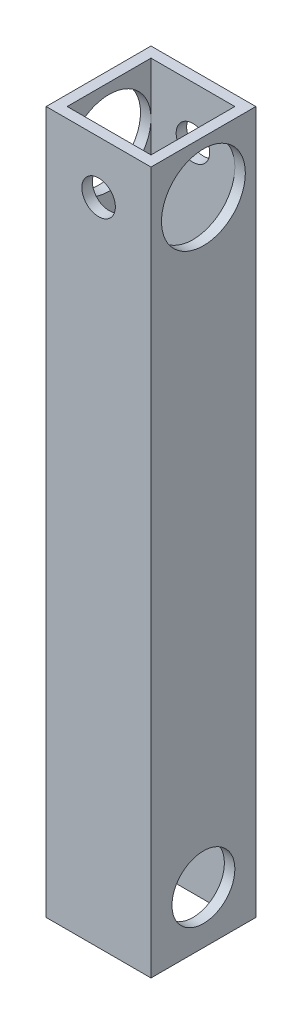
ISO-10303-21;
HEADER;
FILE_DESCRIPTION(('STEP AP214'),'2;1');
FILE_NAME('part.step','',(''),(''),'','','');
FILE_SCHEMA(('AUTOMOTIVE_DESIGN { 1 0 10303 214 1 1 1 1 }'));
ENDSEC;
DATA;
#1=APPLICATION_CONTEXT('core data for automotive mechanical design processes');
#2=APPLICATION_PROTOCOL_DEFINITION('international standard','automotive_design',2000,#1);
#3=PRODUCT_CONTEXT('',#1,'mechanical');
#4=PRODUCT('Part','Part','',(#3));
#5=PRODUCT_RELATED_PRODUCT_CATEGORY('part','',(#4));
#6=PRODUCT_DEFINITION_FORMATION('','',#4);
#7=PRODUCT_DEFINITION_CONTEXT('part definition',#1,'design');
#8=PRODUCT_DEFINITION('design','',#6,#7);
#9=PRODUCT_DEFINITION_SHAPE('','',#8);
#10=(LENGTH_UNIT() NAMED_UNIT(*) SI_UNIT(.MILLI.,.METRE.));
#11=(NAMED_UNIT(*) PLANE_ANGLE_UNIT() SI_UNIT($,.RADIAN.));
#12=(NAMED_UNIT(*) SI_UNIT($,.STERADIAN.) SOLID_ANGLE_UNIT());
#13=UNCERTAINTY_MEASURE_WITH_UNIT(LENGTH_MEASURE(1.E-05),#10,'distance_accuracy_value','');
#14=(GEOMETRIC_REPRESENTATION_CONTEXT(3) GLOBAL_UNCERTAINTY_ASSIGNED_CONTEXT((#13)) GLOBAL_UNIT_ASSIGNED_CONTEXT((#10,
#11,#12)) REPRESENTATION_CONTEXT('',''));
#15=CARTESIAN_POINT('',(0.,0.,0.));
#16=DIRECTION('',(0.,0.,1.));
#17=DIRECTION('',(1.,0.,0.));
#18=AXIS2_PLACEMENT_3D('',#15,#16,#17);
#19=CARTESIAN_POINT('',(1.,67.,0.));
#20=DIRECTION('',(1.,0.,0.));
#21=DIRECTION('',(0.,0.,-1.));
#22=AXIS2_PLACEMENT_3D('',#19,#20,#21);
#23=PLANE('',#22);
#24=CARTESIAN_POINT('',(0.999999999999999,62.,-5.));
#25=DIRECTION('',(1.,0.,0.));
#26=DIRECTION('',(0.,0.,-1.));
#27=AXIS2_PLACEMENT_3D('',#24,#25,#26);
#28=CIRCLE('',#27,4.);
#29=CARTESIAN_POINT('',(0.999999999999999,62.,-9.));
#30=VERTEX_POINT('',#29);
#31=CARTESIAN_POINT('',(1.,62.,-1.));
#32=VERTEX_POINT('',#31);
#33=EDGE_CURVE('E75',#30,#32,#28,.T.);
#34=ORIENTED_EDGE('',*,*,#33,.F.);
#35=DIRECTION('',(0.,-1.,0.));
#36=VECTOR('',#35,1.);
#37=CARTESIAN_POINT('',(1.,67.,-9.));
#38=LINE('',#37,#36);
#39=CARTESIAN_POINT('',(1.,67.,-9.));
#40=VERTEX_POINT('',#39);
#41=EDGE_CURVE('E234',#40,#30,#38,.T.);
#42=ORIENTED_EDGE('',*,*,#41,.F.);
#43=DIRECTION('',(0.,0.,1.));
#44=VECTOR('',#43,1.);
#45=CARTESIAN_POINT('',(1.,67.,0.));
#46=LINE('',#45,#44);
#47=CARTESIAN_POINT('',(1.,67.,-1.));
#48=VERTEX_POINT('',#47);
#49=EDGE_CURVE('E219',#40,#48,#46,.T.);
#50=ORIENTED_EDGE('',*,*,#49,.T.);
#51=DIRECTION('',(0.,-1.,0.));
#52=VECTOR('',#51,1.);
#53=CARTESIAN_POINT('',(1.,67.,-1.));
#54=LINE('',#53,#52);
#55=EDGE_CURVE('E169',#48,#32,#54,.T.);
#56=ORIENTED_EDGE('',*,*,#55,.T.);
#57=EDGE_LOOP('',(#34,#42,#50,#56));
#58=FACE_BOUND('',#57,.T.);
#59=ADVANCED_FACE('F59',(#58),#23,.T.);
#60=CARTESIAN_POINT('',(9.,67.,0.));
#61=DIRECTION('',(-1.,0.,0.));
#62=DIRECTION('',(0.,0.,1.));
#63=AXIS2_PLACEMENT_3D('',#60,#61,#62);
#64=PLANE('',#63);
#65=CARTESIAN_POINT('',(9.,62.,-5.));
#66=DIRECTION('',(-1.,0.,0.));
#67=DIRECTION('',(0.,0.,1.));
#68=AXIS2_PLACEMENT_3D('',#65,#66,#67);
#69=CIRCLE('',#68,4.);
#70=CARTESIAN_POINT('',(9.,62.,-1.));
#71=VERTEX_POINT('',#70);
#72=CARTESIAN_POINT('',(9.,62.,-9.));
#73=VERTEX_POINT('',#72);
#74=EDGE_CURVE('E82',#71,#73,#69,.T.);
#75=ORIENTED_EDGE('',*,*,#74,.F.);
#76=DIRECTION('',(0.,-1.,0.));
#77=VECTOR('',#76,1.);
#78=CARTESIAN_POINT('',(9.,67.,-1.));
#79=LINE('',#78,#77);
#80=CARTESIAN_POINT('',(9.,67.,-1.));
#81=VERTEX_POINT('',#80);
#82=EDGE_CURVE('E149',#81,#71,#79,.T.);
#83=ORIENTED_EDGE('',*,*,#82,.F.);
#84=DIRECTION('',(0.,0.,-1.));
#85=VECTOR('',#84,1.);
#86=CARTESIAN_POINT('',(9.,67.,0.));
#87=LINE('',#86,#85);
#88=CARTESIAN_POINT('',(9.,67.,-9.));
#89=VERTEX_POINT('',#88);
#90=EDGE_CURVE('E223',#81,#89,#87,.T.);
#91=ORIENTED_EDGE('',*,*,#90,.T.);
#92=DIRECTION('',(0.,-1.,0.));
#93=VECTOR('',#92,1.);
#94=CARTESIAN_POINT('',(9.,67.,-9.));
#95=LINE('',#94,#93);
#96=EDGE_CURVE('E151',#89,#73,#95,.T.);
#97=ORIENTED_EDGE('',*,*,#96,.T.);
#98=EDGE_LOOP('',(#75,#83,#91,#97));
#99=FACE_BOUND('',#98,.T.);
#100=ADVANCED_FACE('F146',(#99),#64,.T.);
#101=CARTESIAN_POINT('',(0.,67.,0.));
#102=DIRECTION('',(0.,1.,0.));
#103=DIRECTION('',(0.,0.,1.));
#104=AXIS2_PLACEMENT_3D('',#101,#102,#103);
#105=PLANE('',#104);
#106=DIRECTION('',(0.,0.,1.));
#107=VECTOR('',#106,1.);
#108=CARTESIAN_POINT('',(0.,67.,0.));
#109=LINE('',#108,#107);
#110=CARTESIAN_POINT('',(0.,67.,-10.));
#111=VERTEX_POINT('',#110);
#112=CARTESIAN_POINT('',(0.,67.,0.));
#113=VERTEX_POINT('',#112);
#114=EDGE_CURVE('E176',#111,#113,#109,.T.);
#115=ORIENTED_EDGE('',*,*,#114,.T.);
#116=DIRECTION('',(1.,0.,0.));
#117=VECTOR('',#116,1.);
#118=CARTESIAN_POINT('',(0.,67.,0.));
#119=LINE('',#118,#117);
#120=CARTESIAN_POINT('',(10.,67.,0.));
#121=VERTEX_POINT('',#120);
#122=EDGE_CURVE('E179',#113,#121,#119,.T.);
#123=ORIENTED_EDGE('',*,*,#122,.T.);
#124=DIRECTION('',(0.,0.,-1.));
#125=VECTOR('',#124,1.);
#126=CARTESIAN_POINT('',(10.,67.,0.));
#127=LINE('',#126,#125);
#128=CARTESIAN_POINT('',(10.,67.,-10.));
#129=VERTEX_POINT('',#128);
#130=EDGE_CURVE('E182',#121,#129,#127,.T.);
#131=ORIENTED_EDGE('',*,*,#130,.T.);
#132=DIRECTION('',(-1.,0.,0.));
#133=VECTOR('',#132,1.);
#134=CARTESIAN_POINT('',(0.,67.,-10.));
#135=LINE('',#134,#133);
#136=EDGE_CURVE('E184',#129,#111,#135,.T.);
#137=ORIENTED_EDGE('',*,*,#136,.T.);
#138=EDGE_LOOP('',(#115,#123,#131,#137));
#139=FACE_BOUND('',#138,.T.);
#140=DIRECTION('',(1.,0.,0.));
#141=VECTOR('',#140,1.);
#142=CARTESIAN_POINT('',(0.,67.,-1.));
#143=LINE('',#142,#141);
#144=EDGE_CURVE('E167',#48,#81,#143,.T.);
#145=ORIENTED_EDGE('',*,*,#144,.F.);
#146=ORIENTED_EDGE('',*,*,#49,.F.);
#147=DIRECTION('',(-1.,0.,0.));
#148=VECTOR('',#147,1.);
#149=CARTESIAN_POINT('',(0.,67.,-9.));
#150=LINE('',#149,#148);
#151=EDGE_CURVE('E225',#89,#40,#150,.T.);
#152=ORIENTED_EDGE('',*,*,#151,.F.);
#153=ORIENTED_EDGE('',*,*,#90,.F.);
#154=EDGE_LOOP('',(#145,#146,#152,#153));
#155=FACE_BOUND('',#154,.T.);
#156=ADVANCED_FACE('F252',(#139,#155),#105,.T.);
#157=CARTESIAN_POINT('',(0.,0.,0.));
#158=DIRECTION('',(0.,1.,0.));
#159=DIRECTION('',(0.,0.,1.));
#160=AXIS2_PLACEMENT_3D('',#157,#158,#159);
#161=PLANE('',#160);
#162=DIRECTION('',(0.,0.,1.));
#163=VECTOR('',#162,1.);
#164=CARTESIAN_POINT('',(0.,0.,0.));
#165=LINE('',#164,#163);
#166=CARTESIAN_POINT('',(0.,0.,-10.));
#167=VERTEX_POINT('',#166);
#168=CARTESIAN_POINT('',(0.,0.,0.));
#169=VERTEX_POINT('',#168);
#170=EDGE_CURVE('E175',#167,#169,#165,.T.);
#171=ORIENTED_EDGE('',*,*,#170,.F.);
#172=DIRECTION('',(-1.,0.,0.));
#173=VECTOR('',#172,1.);
#174=CARTESIAN_POINT('',(0.,0.,-10.));
#175=LINE('',#174,#173);
#176=CARTESIAN_POINT('',(10.,0.,-10.));
#177=VERTEX_POINT('',#176);
#178=EDGE_CURVE('E180',#177,#167,#175,.T.);
#179=ORIENTED_EDGE('',*,*,#178,.F.);
#180=DIRECTION('',(0.,0.,-1.));
#181=VECTOR('',#180,1.);
#182=CARTESIAN_POINT('',(10.,0.,0.));
#183=LINE('',#182,#181);
#184=CARTESIAN_POINT('',(10.,0.,0.));
#185=VERTEX_POINT('',#184);
#186=EDGE_CURVE('E191',#185,#177,#183,.T.);
#187=ORIENTED_EDGE('',*,*,#186,.F.);
#188=DIRECTION('',(1.,0.,0.));
#189=VECTOR('',#188,1.);
#190=CARTESIAN_POINT('',(0.,0.,0.));
#191=LINE('',#190,#189);
#192=EDGE_CURVE('E189',#169,#185,#191,.T.);
#193=ORIENTED_EDGE('',*,*,#192,.F.);
#194=EDGE_LOOP('',(#171,#179,#187,#193));
#195=FACE_BOUND('',#194,.T.);
#196=DIRECTION('',(0.,0.,1.));
#197=VECTOR('',#196,1.);
#198=CARTESIAN_POINT('',(1.,0.,0.));
#199=LINE('',#198,#197);
#200=CARTESIAN_POINT('',(1.,0.,-9.));
#201=VERTEX_POINT('',#200);
#202=CARTESIAN_POINT('',(1.,0.,-1.));
#203=VERTEX_POINT('',#202);
#204=EDGE_CURVE('E207',#201,#203,#199,.T.);
#205=ORIENTED_EDGE('',*,*,#204,.T.);
#206=DIRECTION('',(1.,0.,0.));
#207=VECTOR('',#206,1.);
#208=CARTESIAN_POINT('',(0.,0.,-1.));
#209=LINE('',#208,#207);
#210=CARTESIAN_POINT('',(9.,0.,-1.));
#211=VERTEX_POINT('',#210);
#212=EDGE_CURVE('E230',#203,#211,#209,.T.);
#213=ORIENTED_EDGE('',*,*,#212,.T.);
#214=DIRECTION('',(0.,0.,-1.));
#215=VECTOR('',#214,1.);
#216=CARTESIAN_POINT('',(9.,0.,0.));
#217=LINE('',#216,#215);
#218=CARTESIAN_POINT('',(9.,0.,-9.));
#219=VERTEX_POINT('',#218);
#220=EDGE_CURVE('E158',#211,#219,#217,.T.);
#221=ORIENTED_EDGE('',*,*,#220,.T.);
#222=DIRECTION('',(-1.,0.,0.));
#223=VECTOR('',#222,1.);
#224=CARTESIAN_POINT('',(0.,0.,-9.));
#225=LINE('',#224,#223);
#226=EDGE_CURVE('E221',#219,#201,#225,.T.);
#227=ORIENTED_EDGE('',*,*,#226,.T.);
#228=EDGE_LOOP('',(#205,#213,#221,#227));
#229=FACE_BOUND('',#228,.T.);
#230=ADVANCED_FACE('F247',(#195,#229),#161,.F.);
#231=CARTESIAN_POINT('',(0.,67.,0.));
#232=DIRECTION('',(1.,0.,0.));
#233=DIRECTION('',(0.,0.,-1.));
#234=AXIS2_PLACEMENT_3D('',#231,#232,#233);
#235=PLANE('',#234);
#236=CARTESIAN_POINT('',(0.,62.,-5.));
#237=DIRECTION('',(1.,0.,0.));
#238=DIRECTION('',(0.,0.,-1.));
#239=AXIS2_PLACEMENT_3D('',#236,#237,#238);
#240=CIRCLE('',#239,4.);
#241=CARTESIAN_POINT('',(0.,62.,-9.));
#242=VERTEX_POINT('',#241);
#243=EDGE_CURVE('E141',#242,#242,#240,.F.);
#244=ORIENTED_EDGE('',*,*,#243,.F.);
#245=EDGE_LOOP('',(#244));
#246=FACE_BOUND('',#245,.T.);
#247=CARTESIAN_POINT('',(0.,5.,-5.00000000000001));
#248=DIRECTION('',(1.,0.,0.));
#249=DIRECTION('',(0.,0.,-1.));
#250=AXIS2_PLACEMENT_3D('',#247,#248,#249);
#251=CIRCLE('',#250,3.);
#252=CARTESIAN_POINT('',(0.,5.,-8.00000000000001));
#253=VERTEX_POINT('',#252);
#254=EDGE_CURVE('E381',#253,#253,#251,.F.);
#255=ORIENTED_EDGE('',*,*,#254,.F.);
#256=EDGE_LOOP('',(#255));
#257=FACE_BOUND('',#256,.T.);
#258=ORIENTED_EDGE('',*,*,#170,.T.);
#259=DIRECTION('',(0.,-1.,0.));
#260=VECTOR('',#259,1.);
#261=CARTESIAN_POINT('',(0.,67.,0.));
#262=LINE('',#261,#260);
#263=EDGE_CURVE('E12',#113,#169,#262,.T.);
#264=ORIENTED_EDGE('',*,*,#263,.F.);
#265=ORIENTED_EDGE('',*,*,#114,.F.);
#266=DIRECTION('',(0.,-1.,0.));
#267=VECTOR('',#266,1.);
#268=CARTESIAN_POINT('',(0.,67.,-10.));
#269=LINE('',#268,#267);
#270=EDGE_CURVE('E186',#111,#167,#269,.T.);
#271=ORIENTED_EDGE('',*,*,#270,.T.);
#272=EDGE_LOOP('',(#258,#264,#265,#271));
#273=FACE_BOUND('',#272,.T.);
#274=ADVANCED_FACE('F61',(#246,#257,#273),#235,.F.);
#275=CARTESIAN_POINT('',(0.,67.,0.));
#276=DIRECTION('',(0.,0.,-1.));
#277=DIRECTION('',(-1.,0.,0.));
#278=AXIS2_PLACEMENT_3D('',#275,#276,#277);
#279=PLANE('',#278);
#280=CARTESIAN_POINT('',(5.,62.,0.));
#281=DIRECTION('',(0.,0.,1.));
#282=DIRECTION('',(1.,0.,0.));
#283=AXIS2_PLACEMENT_3D('',#280,#281,#282);
#284=CIRCLE('',#283,1.6);
#285=CARTESIAN_POINT('',(6.6,62.,0.));
#286=VERTEX_POINT('',#285);
#287=EDGE_CURVE('E210',#286,#286,#284,.T.);
#288=ORIENTED_EDGE('',*,*,#287,.F.);
#289=EDGE_LOOP('',(#288));
#290=FACE_BOUND('',#289,.T.);
#291=ORIENTED_EDGE('',*,*,#192,.T.);
#292=DIRECTION('',(0.,-1.,0.));
#293=VECTOR('',#292,1.);
#294=CARTESIAN_POINT('',(10.,67.,0.));
#295=LINE('',#294,#293);
#296=EDGE_CURVE('E68',#121,#185,#295,.T.);
#297=ORIENTED_EDGE('',*,*,#296,.F.);
#298=ORIENTED_EDGE('',*,*,#122,.F.);
#299=ORIENTED_EDGE('',*,*,#263,.T.);
#300=EDGE_LOOP('',(#291,#297,#298,#299));
#301=FACE_BOUND('',#300,.T.);
#302=ADVANCED_FACE('F281',(#290,#301),#279,.F.);
#303=CARTESIAN_POINT('',(10.,67.,0.));
#304=DIRECTION('',(-1.,0.,0.));
#305=DIRECTION('',(0.,0.,1.));
#306=AXIS2_PLACEMENT_3D('',#303,#304,#305);
#307=PLANE('',#306);
#308=CARTESIAN_POINT('',(10.,62.,-5.));
#309=DIRECTION('',(1.,0.,0.));
#310=DIRECTION('',(0.,0.,-1.));
#311=AXIS2_PLACEMENT_3D('',#308,#309,#310);
#312=CIRCLE('',#311,4.);
#313=CARTESIAN_POINT('',(10.,62.,-9.));
#314=VERTEX_POINT('',#313);
#315=EDGE_CURVE('E378',#314,#314,#312,.T.);
#316=ORIENTED_EDGE('',*,*,#315,.F.);
#317=EDGE_LOOP('',(#316));
#318=FACE_BOUND('',#317,.T.);
#319=CARTESIAN_POINT('',(10.,5.,-5.00000000000001));
#320=DIRECTION('',(1.,0.,0.));
#321=DIRECTION('',(0.,0.,-1.));
#322=AXIS2_PLACEMENT_3D('',#319,#320,#321);
#323=CIRCLE('',#322,3.);
#324=CARTESIAN_POINT('',(10.,5.,-8.00000000000001));
#325=VERTEX_POINT('',#324);
#326=EDGE_CURVE('E384',#325,#325,#323,.T.);
#327=ORIENTED_EDGE('',*,*,#326,.F.);
#328=EDGE_LOOP('',(#327));
#329=FACE_BOUND('',#328,.T.);
#330=ORIENTED_EDGE('',*,*,#186,.T.);
#331=DIRECTION('',(0.,-1.,0.));
#332=VECTOR('',#331,1.);
#333=CARTESIAN_POINT('',(10.,67.,-10.));
#334=LINE('',#333,#332);
#335=EDGE_CURVE('E196',#129,#177,#334,.T.);
#336=ORIENTED_EDGE('',*,*,#335,.F.);
#337=ORIENTED_EDGE('',*,*,#130,.F.);
#338=ORIENTED_EDGE('',*,*,#296,.T.);
#339=EDGE_LOOP('',(#330,#336,#337,#338));
#340=FACE_BOUND('',#339,.T.);
#341=ADVANCED_FACE('F275',(#318,#329,#340),#307,.F.);
#342=CARTESIAN_POINT('',(0.,67.,-10.));
#343=DIRECTION('',(0.,0.,1.));
#344=DIRECTION('',(1.,0.,0.));
#345=AXIS2_PLACEMENT_3D('',#342,#343,#344);
#346=PLANE('',#345);
#347=CARTESIAN_POINT('',(5.,62.,-10.));
#348=DIRECTION('',(0.,0.,1.));
#349=DIRECTION('',(1.,0.,0.));
#350=AXIS2_PLACEMENT_3D('',#347,#348,#349);
#351=CIRCLE('',#350,1.6);
#352=CARTESIAN_POINT('',(6.6,62.,-10.));
#353=VERTEX_POINT('',#352);
#354=EDGE_CURVE('E203',#353,#353,#351,.F.);
#355=ORIENTED_EDGE('',*,*,#354,.F.);
#356=EDGE_LOOP('',(#355));
#357=FACE_BOUND('',#356,.T.);
#358=ORIENTED_EDGE('',*,*,#178,.T.);
#359=ORIENTED_EDGE('',*,*,#270,.F.);
#360=ORIENTED_EDGE('',*,*,#136,.F.);
#361=ORIENTED_EDGE('',*,*,#335,.T.);
#362=EDGE_LOOP('',(#358,#359,#360,#361));
#363=FACE_BOUND('',#362,.T.);
#364=ADVANCED_FACE('F269',(#357,#363),#346,.F.);
#365=EDGE_CURVE('E152',#32,#30,#28,.T.);
#366=ORIENTED_EDGE('',*,*,#365,.F.);
#367=EDGE_CURVE('E168',#32,#203,#54,.T.);
#368=ORIENTED_EDGE('',*,*,#367,.T.);
#369=ORIENTED_EDGE('',*,*,#204,.F.);
#370=EDGE_CURVE('E227',#30,#201,#38,.T.);
#371=ORIENTED_EDGE('',*,*,#370,.F.);
#372=EDGE_LOOP('',(#366,#368,#369,#371));
#373=FACE_BOUND('',#372,.T.);
#374=CARTESIAN_POINT('',(0.999999999999999,5.,-5.00000000000001));
#375=DIRECTION('',(1.,0.,0.));
#376=DIRECTION('',(0.,0.,-1.));
#377=AXIS2_PLACEMENT_3D('',#374,#375,#376);
#378=CIRCLE('',#377,3.);
#379=CARTESIAN_POINT('',(0.999999999999999,5.,-8.00000000000001));
#380=VERTEX_POINT('',#379);
#381=EDGE_CURVE('E215',#380,#380,#378,.T.);
#382=ORIENTED_EDGE('',*,*,#381,.F.);
#383=EDGE_LOOP('',(#382));
#384=FACE_BOUND('',#383,.T.);
#385=ADVANCED_FACE('F244',(#373,#384),#23,.T.);
#386=CARTESIAN_POINT('',(0.,67.,-1.));
#387=DIRECTION('',(0.,0.,-1.));
#388=DIRECTION('',(-1.,0.,0.));
#389=AXIS2_PLACEMENT_3D('',#386,#387,#388);
#390=PLANE('',#389);
#391=CARTESIAN_POINT('',(5.,62.,-0.999999999999999));
#392=DIRECTION('',(0.,0.,-1.));
#393=DIRECTION('',(-1.,0.,0.));
#394=AXIS2_PLACEMENT_3D('',#391,#392,#393);
#395=CIRCLE('',#394,1.6);
#396=CARTESIAN_POINT('',(6.6,62.,-0.999999999999997));
#397=VERTEX_POINT('',#396);
#398=EDGE_CURVE('E202',#397,#397,#395,.T.);
#399=ORIENTED_EDGE('',*,*,#398,.F.);
#400=EDGE_LOOP('',(#399));
#401=FACE_BOUND('',#400,.T.);
#402=ORIENTED_EDGE('',*,*,#367,.F.);
#403=ORIENTED_EDGE('',*,*,#55,.F.);
#404=ORIENTED_EDGE('',*,*,#144,.T.);
#405=ORIENTED_EDGE('',*,*,#82,.T.);
#406=EDGE_CURVE('E154',#71,#211,#79,.T.);
#407=ORIENTED_EDGE('',*,*,#406,.T.);
#408=ORIENTED_EDGE('',*,*,#212,.F.);
#409=EDGE_LOOP('',(#402,#403,#404,#405,#407,#408));
#410=FACE_BOUND('',#409,.T.);
#411=ADVANCED_FACE('F164',(#401,#410),#390,.T.);
#412=EDGE_CURVE('E135',#73,#71,#69,.T.);
#413=ORIENTED_EDGE('',*,*,#412,.F.);
#414=EDGE_CURVE('E236',#73,#219,#95,.T.);
#415=ORIENTED_EDGE('',*,*,#414,.T.);
#416=ORIENTED_EDGE('',*,*,#220,.F.);
#417=ORIENTED_EDGE('',*,*,#406,.F.);
#418=EDGE_LOOP('',(#413,#415,#416,#417));
#419=FACE_BOUND('',#418,.T.);
#420=CARTESIAN_POINT('',(9.,5.,-5.00000000000001));
#421=DIRECTION('',(-1.,0.,0.));
#422=DIRECTION('',(0.,0.,1.));
#423=AXIS2_PLACEMENT_3D('',#420,#421,#422);
#424=CIRCLE('',#423,3.);
#425=CARTESIAN_POINT('',(9.,5.,-2.00000000000001));
#426=VERTEX_POINT('',#425);
#427=EDGE_CURVE('E63',#426,#426,#424,.T.);
#428=ORIENTED_EDGE('',*,*,#427,.F.);
#429=EDGE_LOOP('',(#428));
#430=FACE_BOUND('',#429,.T.);
#431=ADVANCED_FACE('F155',(#419,#430),#64,.T.);
#432=CARTESIAN_POINT('',(0.,67.,-9.));
#433=DIRECTION('',(0.,0.,1.));
#434=DIRECTION('',(1.,0.,0.));
#435=AXIS2_PLACEMENT_3D('',#432,#433,#434);
#436=PLANE('',#435);
#437=CARTESIAN_POINT('',(5.,62.,-9.));
#438=DIRECTION('',(0.,0.,1.));
#439=DIRECTION('',(1.,0.,0.));
#440=AXIS2_PLACEMENT_3D('',#437,#438,#439);
#441=CIRCLE('',#440,1.6);
#442=CARTESIAN_POINT('',(6.6,62.,-9.));
#443=VERTEX_POINT('',#442);
#444=EDGE_CURVE('E200',#443,#443,#441,.T.);
#445=ORIENTED_EDGE('',*,*,#444,.F.);
#446=EDGE_LOOP('',(#445));
#447=FACE_BOUND('',#446,.T.);
#448=ORIENTED_EDGE('',*,*,#41,.T.);
#449=ORIENTED_EDGE('',*,*,#370,.T.);
#450=ORIENTED_EDGE('',*,*,#226,.F.);
#451=ORIENTED_EDGE('',*,*,#414,.F.);
#452=ORIENTED_EDGE('',*,*,#96,.F.);
#453=ORIENTED_EDGE('',*,*,#151,.T.);
#454=EDGE_LOOP('',(#448,#449,#450,#451,#452,#453));
#455=FACE_BOUND('',#454,.T.);
#456=ADVANCED_FACE('F242',(#447,#455),#436,.T.);
#457=CARTESIAN_POINT('',(5.,62.,-14.5254833995939));
#458=DIRECTION('',(0.,0.,1.));
#459=DIRECTION('',(1.,0.,0.));
#460=AXIS2_PLACEMENT_3D('',#457,#458,#459);
#461=CYLINDRICAL_SURFACE('',#460,1.6);
#462=CARTESIAN_POINT('',(6.6,62.,-9.));
#463=CARTESIAN_POINT('',(6.6,62.,-9.01041666666667));
#464=CARTESIAN_POINT('',(6.6,62.,-9.02083333333333));
#465=CARTESIAN_POINT('',(6.6,62.,-9.04166666666667));
#466=CARTESIAN_POINT('',(6.6,62.,-9.05208333333333));
#467=CARTESIAN_POINT('',(6.6,62.,-9.07291666666667));
#468=CARTESIAN_POINT('',(6.6,62.,-9.08333333333333));
#469=CARTESIAN_POINT('',(6.6,62.,-9.10416666666667));
#470=CARTESIAN_POINT('',(6.6,62.,-9.11458333333333));
#471=CARTESIAN_POINT('',(6.6,62.,-9.13541666666667));
#472=CARTESIAN_POINT('',(6.6,62.,-9.14583333333333));
#473=CARTESIAN_POINT('',(6.6,62.,-9.16666666666667));
#474=CARTESIAN_POINT('',(6.6,62.,-9.17708333333333));
#475=CARTESIAN_POINT('',(6.6,62.,-9.19791666666667));
#476=CARTESIAN_POINT('',(6.6,62.,-9.20833333333333));
#477=CARTESIAN_POINT('',(6.6,62.,-9.22916666666667));
#478=CARTESIAN_POINT('',(6.6,62.,-9.23958333333333));
#479=CARTESIAN_POINT('',(6.6,62.,-9.26041666666667));
#480=CARTESIAN_POINT('',(6.6,62.,-9.27083333333333));
#481=CARTESIAN_POINT('',(6.6,62.,-9.29166666666667));
#482=CARTESIAN_POINT('',(6.6,62.,-9.30208333333333));
#483=CARTESIAN_POINT('',(6.6,62.,-9.32291666666667));
#484=CARTESIAN_POINT('',(6.6,62.,-9.33333333333333));
#485=CARTESIAN_POINT('',(6.6,62.,-9.35416666666667));
#486=CARTESIAN_POINT('',(6.6,62.,-9.36458333333333));
#487=CARTESIAN_POINT('',(6.6,62.,-9.38541666666667));
#488=CARTESIAN_POINT('',(6.6,62.,-9.39583333333333));
#489=CARTESIAN_POINT('',(6.6,62.,-9.41666666666667));
#490=CARTESIAN_POINT('',(6.6,62.,-9.42708333333333));
#491=CARTESIAN_POINT('',(6.6,62.,-9.44791666666667));
#492=CARTESIAN_POINT('',(6.6,62.,-9.45833333333333));
#493=CARTESIAN_POINT('',(6.6,62.,-9.47916666666667));
#494=CARTESIAN_POINT('',(6.6,62.,-9.48958333333333));
#495=CARTESIAN_POINT('',(6.6,62.,-9.51041666666667));
#496=CARTESIAN_POINT('',(6.6,62.,-9.52083333333333));
#497=CARTESIAN_POINT('',(6.6,62.,-9.54166666666667));
#498=CARTESIAN_POINT('',(6.6,62.,-9.55208333333333));
#499=CARTESIAN_POINT('',(6.6,62.,-9.57291666666667));
#500=CARTESIAN_POINT('',(6.6,62.,-9.58333333333333));
#501=CARTESIAN_POINT('',(6.6,62.,-9.60416666666667));
#502=CARTESIAN_POINT('',(6.6,62.,-9.61458333333333));
#503=CARTESIAN_POINT('',(6.6,62.,-9.63541666666667));
#504=CARTESIAN_POINT('',(6.6,62.,-9.64583333333333));
#505=CARTESIAN_POINT('',(6.6,62.,-9.66666666666667));
#506=CARTESIAN_POINT('',(6.6,62.,-9.67708333333333));
#507=CARTESIAN_POINT('',(6.6,62.,-9.69791666666667));
#508=CARTESIAN_POINT('',(6.6,62.,-9.70833333333333));
#509=CARTESIAN_POINT('',(6.6,62.,-9.72916666666667));
#510=CARTESIAN_POINT('',(6.6,62.,-9.73958333333333));
#511=CARTESIAN_POINT('',(6.6,62.,-9.76041666666667));
#512=CARTESIAN_POINT('',(6.6,62.,-9.77083333333333));
#513=CARTESIAN_POINT('',(6.6,62.,-9.79166666666667));
#514=CARTESIAN_POINT('',(6.6,62.,-9.80208333333333));
#515=CARTESIAN_POINT('',(6.6,62.,-9.82291666666667));
#516=CARTESIAN_POINT('',(6.6,62.,-9.83333333333333));
#517=CARTESIAN_POINT('',(6.6,62.,-9.85416666666667));
#518=CARTESIAN_POINT('',(6.6,62.,-9.86458333333333));
#519=CARTESIAN_POINT('',(6.6,62.,-9.88541666666667));
#520=CARTESIAN_POINT('',(6.6,62.,-9.89583333333333));
#521=CARTESIAN_POINT('',(6.6,62.,-9.91666666666667));
#522=CARTESIAN_POINT('',(6.6,62.,-9.92708333333333));
#523=CARTESIAN_POINT('',(6.6,62.,-9.94791666666667));
#524=CARTESIAN_POINT('',(6.6,62.,-9.95833333333333));
#525=CARTESIAN_POINT('',(6.6,62.,-9.97916666666667));
#526=CARTESIAN_POINT('',(6.6,62.,-9.98958333333333));
#527=CARTESIAN_POINT('',(6.6,62.,-10.));
#528=B_SPLINE_CURVE_WITH_KNOTS('',3,(#462,#463,#464,#465,#466,#467,#468,#469,#470,#471,#472,
#473,#474,#475,#476,#477,#478,#479,#480,#481,#482,#483,#484,#485,#486,#487,#488,#489,#490,#491,
#492,#493,#494,#495,#496,#497,#498,#499,#500,#501,#502,#503,#504,#505,#506,#507,#508,#509,#510,
#511,#512,#513,#514,#515,#516,#517,#518,#519,#520,#521,#522,#523,#524,#525,#526,#527),
.UNSPECIFIED.,.F.,.F.,(4,2,2,2,2,2,2,2,2,2,2,2,2,2,2,2,2,2,2,2,2,2,2,2,2,2,2,2,2,2,2,2,4),(0.,
0.03125,0.0625000000000001,0.0937500000000001,0.125,0.15625,0.1875,0.21875,0.25,0.28125,0.3125,
0.34375,0.375,0.40625,0.4375,0.46875,0.5,0.53125,0.5625,0.593750000000001,0.625000000000001,
0.656250000000001,0.687500000000001,0.718750000000001,0.750000000000001,0.781250000000001,
0.812500000000001,0.843750000000001,0.875000000000001,0.906250000000001,0.937500000000001,
0.968750000000001,1.),.UNSPECIFIED.);
#529=EDGE_CURVE('BSEAM309',#443,#353,#528,.T.);
#530=ORIENTED_EDGE('',*,*,#444,.T.);
#531=ORIENTED_EDGE('',*,*,#354,.T.);
#532=ORIENTED_EDGE('',*,*,#529,.T.);
#533=ORIENTED_EDGE('',*,*,#529,.F.);
#534=EDGE_LOOP('',(#530,#532,#531,#533));
#535=FACE_BOUND('',#534,.T.);
#536=ADVANCED_FACE('F309',(#535),#461,.F.);
#537=CARTESIAN_POINT('',(6.6,62.,-0.999999999999997));
#538=CARTESIAN_POINT('',(6.6,62.,-0.989583333333331));
#539=CARTESIAN_POINT('',(6.6,62.,-0.979166666666664));
#540=CARTESIAN_POINT('',(6.6,62.,-0.958333333333331));
#541=CARTESIAN_POINT('',(6.6,62.,-0.947916666666664));
#542=CARTESIAN_POINT('',(6.6,62.,-0.927083333333331));
#543=CARTESIAN_POINT('',(6.6,62.,-0.916666666666664));
#544=CARTESIAN_POINT('',(6.6,62.,-0.895833333333331));
#545=CARTESIAN_POINT('',(6.6,62.,-0.885416666666664));
#546=CARTESIAN_POINT('',(6.6,62.,-0.864583333333331));
#547=CARTESIAN_POINT('',(6.6,62.,-0.854166666666664));
#548=CARTESIAN_POINT('',(6.6,62.,-0.833333333333331));
#549=CARTESIAN_POINT('',(6.6,62.,-0.822916666666664));
#550=CARTESIAN_POINT('',(6.6,62.,-0.802083333333331));
#551=CARTESIAN_POINT('',(6.6,62.,-0.791666666666664));
#552=CARTESIAN_POINT('',(6.6,62.,-0.77083333333333));
#553=CARTESIAN_POINT('',(6.6,62.,-0.760416666666664));
#554=CARTESIAN_POINT('',(6.6,62.,-0.739583333333331));
#555=CARTESIAN_POINT('',(6.6,62.,-0.729166666666665));
#556=CARTESIAN_POINT('',(6.6,62.,-0.708333333333332));
#557=CARTESIAN_POINT('',(6.6,62.,-0.697916666666666));
#558=CARTESIAN_POINT('',(6.6,62.,-0.677083333333332));
#559=CARTESIAN_POINT('',(6.6,62.,-0.666666666666666));
#560=CARTESIAN_POINT('',(6.6,62.,-0.645833333333332));
#561=CARTESIAN_POINT('',(6.6,62.,-0.635416666666666));
#562=CARTESIAN_POINT('',(6.6,62.,-0.614583333333332));
#563=CARTESIAN_POINT('',(6.6,62.,-0.604166666666666));
#564=CARTESIAN_POINT('',(6.6,62.,-0.583333333333332));
#565=CARTESIAN_POINT('',(6.6,62.,-0.572916666666666));
#566=CARTESIAN_POINT('',(6.6,62.,-0.552083333333332));
#567=CARTESIAN_POINT('',(6.6,62.,-0.541666666666665));
#568=CARTESIAN_POINT('',(6.6,62.,-0.520833333333332));
#569=CARTESIAN_POINT('',(6.6,62.,-0.510416666666665));
#570=CARTESIAN_POINT('',(6.6,62.,-0.489583333333332));
#571=CARTESIAN_POINT('',(6.6,62.,-0.479166666666665));
#572=CARTESIAN_POINT('',(6.6,62.,-0.458333333333332));
#573=CARTESIAN_POINT('',(6.6,62.,-0.447916666666665));
#574=CARTESIAN_POINT('',(6.6,62.,-0.427083333333332));
#575=CARTESIAN_POINT('',(6.6,62.,-0.416666666666665));
#576=CARTESIAN_POINT('',(6.6,62.,-0.395833333333332));
#577=CARTESIAN_POINT('',(6.6,62.,-0.385416666666665));
#578=CARTESIAN_POINT('',(6.6,62.,-0.364583333333332));
#579=CARTESIAN_POINT('',(6.6,62.,-0.354166666666665));
#580=CARTESIAN_POINT('',(6.6,62.,-0.333333333333332));
#581=CARTESIAN_POINT('',(6.6,62.,-0.322916666666665));
#582=CARTESIAN_POINT('',(6.6,62.,-0.302083333333332));
#583=CARTESIAN_POINT('',(6.6,62.,-0.291666666666665));
#584=CARTESIAN_POINT('',(6.6,62.,-0.270833333333332));
#585=CARTESIAN_POINT('',(6.6,62.,-0.260416666666666));
#586=CARTESIAN_POINT('',(6.6,62.,-0.239583333333334));
#587=CARTESIAN_POINT('',(6.6,62.,-0.229166666666667));
#588=CARTESIAN_POINT('',(6.6,62.,-0.208333333333334));
#589=CARTESIAN_POINT('',(6.6,62.,-0.197916666666667));
#590=CARTESIAN_POINT('',(6.6,62.,-0.177083333333333));
#591=CARTESIAN_POINT('',(6.6,62.,-0.166666666666667));
#592=CARTESIAN_POINT('',(6.6,62.,-0.145833333333333));
#593=CARTESIAN_POINT('',(6.6,62.,-0.135416666666667));
#594=CARTESIAN_POINT('',(6.6,62.,-0.114583333333333));
#595=CARTESIAN_POINT('',(6.6,62.,-0.104166666666667));
#596=CARTESIAN_POINT('',(6.6,62.,-0.0833333333333334));
#597=CARTESIAN_POINT('',(6.6,62.,-0.0729166666666667));
#598=CARTESIAN_POINT('',(6.6,62.,-0.0520833333333334));
#599=CARTESIAN_POINT('',(6.6,62.,-0.0416666666666667));
#600=CARTESIAN_POINT('',(6.6,62.,-0.0208333333333333));
#601=CARTESIAN_POINT('',(6.6,62.,-0.0104166666666667));
#602=CARTESIAN_POINT('',(6.6,62.,0.));
#603=B_SPLINE_CURVE_WITH_KNOTS('',3,(#537,#538,#539,#540,#541,#542,#543,#544,#545,#546,#547,
#548,#549,#550,#551,#552,#553,#554,#555,#556,#557,#558,#559,#560,#561,#562,#563,#564,#565,#566,
#567,#568,#569,#570,#571,#572,#573,#574,#575,#576,#577,#578,#579,#580,#581,#582,#583,#584,#585,
#586,#587,#588,#589,#590,#591,#592,#593,#594,#595,#596,#597,#598,#599,#600,#601,#602),
.UNSPECIFIED.,.F.,.F.,(4,2,2,2,2,2,2,2,2,2,2,2,2,2,2,2,2,2,2,2,2,2,2,2,2,2,2,2,2,2,2,2,4),(0.,
0.03125,0.0625000000000001,0.0937500000000001,0.125,0.15625,0.1875,0.21875,0.25,
0.281249999999999,0.312499999999999,0.343749999999999,0.374999999999999,0.406249999999999,
0.437499999999999,0.468749999999999,0.499999999999999,0.531249999999999,0.562499999999999,
0.593749999999999,0.624999999999999,0.656249999999999,0.687499999999999,0.718749999999999,
0.749999999999997,0.781249999999997,0.812499999999997,0.843749999999997,0.874999999999997,
0.906249999999997,0.937499999999997,0.968749999999997,0.999999999999997),.UNSPECIFIED.);
#604=EDGE_CURVE('BSEAM306',#397,#286,#603,.T.);
#605=ORIENTED_EDGE('',*,*,#398,.T.);
#606=ORIENTED_EDGE('',*,*,#287,.T.);
#607=ORIENTED_EDGE('',*,*,#604,.T.);
#608=ORIENTED_EDGE('',*,*,#604,.F.);
#609=EDGE_LOOP('',(#605,#607,#606,#608));
#610=FACE_BOUND('',#609,.T.);
#611=ADVANCED_FACE('F306',(#610),#461,.F.);
#612=CARTESIAN_POINT('',(-11.3137084989848,5.,-5.00000000000001));
#613=DIRECTION('',(1.,0.,0.));
#614=DIRECTION('',(0.,0.,-1.));
#615=AXIS2_PLACEMENT_3D('',#612,#613,#614);
#616=CYLINDRICAL_SURFACE('',#615,3.);
#617=ORIENTED_EDGE('',*,*,#427,.T.);
#618=EDGE_LOOP('',(#617));
#619=FACE_BOUND('',#618,.T.);
#620=ORIENTED_EDGE('',*,*,#326,.T.);
#621=EDGE_LOOP('',(#620));
#622=FACE_BOUND('',#621,.T.);
#623=ADVANCED_FACE('F308',(#619,#622),#616,.F.);
#624=CARTESIAN_POINT('',(-11.3137084989848,62.,-5.));
#625=DIRECTION('',(1.,0.,0.));
#626=DIRECTION('',(0.,0.,-1.));
#627=AXIS2_PLACEMENT_3D('',#624,#625,#626);
#628=CYLINDRICAL_SURFACE('',#627,4.);
#629=ORIENTED_EDGE('',*,*,#74,.T.);
#630=ORIENTED_EDGE('',*,*,#412,.T.);
#631=EDGE_LOOP('',(#629,#630));
#632=FACE_BOUND('',#631,.T.);
#633=ORIENTED_EDGE('',*,*,#315,.T.);
#634=EDGE_LOOP('',(#633));
#635=FACE_BOUND('',#634,.T.);
#636=ADVANCED_FACE('F136',(#632,#635),#628,.F.);
#637=ORIENTED_EDGE('',*,*,#381,.T.);
#638=EDGE_LOOP('',(#637));
#639=FACE_BOUND('',#638,.T.);
#640=ORIENTED_EDGE('',*,*,#254,.T.);
#641=EDGE_LOOP('',(#640));
#642=FACE_BOUND('',#641,.T.);
#643=ADVANCED_FACE('F318',(#639,#642),#616,.F.);
#644=ORIENTED_EDGE('',*,*,#33,.T.);
#645=ORIENTED_EDGE('',*,*,#365,.T.);
#646=EDGE_LOOP('',(#644,#645));
#647=FACE_BOUND('',#646,.T.);
#648=ORIENTED_EDGE('',*,*,#243,.T.);
#649=EDGE_LOOP('',(#648));
#650=FACE_BOUND('',#649,.T.);
#651=ADVANCED_FACE('F357',(#647,#650),#628,.F.);
#652=CLOSED_SHELL('',(#59,#100,#156,#230,#274,#302,#341,#364,#385,#411,#431,#456,#536,#611,#623,
#636,#643,#651));
#653=MANIFOLD_SOLID_BREP('B2',#652);
#654=ADVANCED_BREP_SHAPE_REPRESENTATION('',(#18,#653),#14);
#655=SHAPE_DEFINITION_REPRESENTATION(#9,#654);
ENDSEC;
END-ISO-10303-21;
